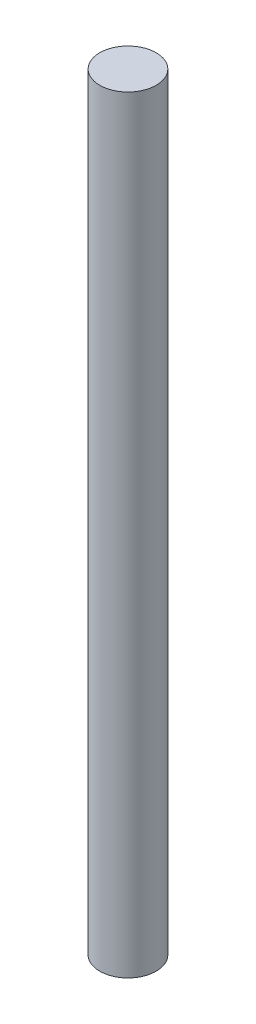
ISO-10303-21;
HEADER;
FILE_DESCRIPTION(('STEP AP214'),'2;1');
FILE_NAME('part.step','',(''),(''),'','','');
FILE_SCHEMA(('AUTOMOTIVE_DESIGN { 1 0 10303 214 1 1 1 1 }'));
ENDSEC;
DATA;
#1=APPLICATION_CONTEXT('core data for automotive mechanical design processes');
#2=APPLICATION_PROTOCOL_DEFINITION('international standard','automotive_design',2000,#1);
#3=PRODUCT_CONTEXT('',#1,'mechanical');
#4=PRODUCT('Part','Part','',(#3));
#5=PRODUCT_RELATED_PRODUCT_CATEGORY('part','',(#4));
#6=PRODUCT_DEFINITION_FORMATION('','',#4);
#7=PRODUCT_DEFINITION_CONTEXT('part definition',#1,'design');
#8=PRODUCT_DEFINITION('design','',#6,#7);
#9=PRODUCT_DEFINITION_SHAPE('','',#8);
#10=(LENGTH_UNIT() NAMED_UNIT(*) SI_UNIT(.MILLI.,.METRE.));
#11=(NAMED_UNIT(*) PLANE_ANGLE_UNIT() SI_UNIT($,.RADIAN.));
#12=(NAMED_UNIT(*) SI_UNIT($,.STERADIAN.) SOLID_ANGLE_UNIT());
#13=UNCERTAINTY_MEASURE_WITH_UNIT(LENGTH_MEASURE(1.E-05),#10,'distance_accuracy_value','');
#14=(GEOMETRIC_REPRESENTATION_CONTEXT(3) GLOBAL_UNCERTAINTY_ASSIGNED_CONTEXT((#13)) GLOBAL_UNIT_ASSIGNED_CONTEXT((#10,
#11,#12)) REPRESENTATION_CONTEXT('',''));
#15=CARTESIAN_POINT('',(0.,0.,0.));
#16=DIRECTION('',(0.,0.,1.));
#17=DIRECTION('',(1.,0.,0.));
#18=AXIS2_PLACEMENT_3D('',#15,#16,#17);
#19=CARTESIAN_POINT('',(7.49999999999998,204.,0.));
#20=DIRECTION('',(0.,-1.,0.));
#21=DIRECTION('',(1.,0.,0.));
#22=AXIS2_PLACEMENT_3D('',#19,#20,#21);
#23=PLANE('',#22);
#24=CARTESIAN_POINT('',(0.,204.,0.));
#25=DIRECTION('',(0.,1.,0.));
#26=DIRECTION('',(-1.,0.,0.));
#27=AXIS2_PLACEMENT_3D('',#24,#25,#26);
#28=CIRCLE('',#27,7.49999999999997);
#29=CARTESIAN_POINT('',(-7.49999999999997,204.,0.));
#30=VERTEX_POINT('',#29);
#31=EDGE_CURVE('E151',#30,#30,#28,.T.);
#32=ORIENTED_EDGE('',*,*,#31,.T.);
#33=EDGE_LOOP('',(#32));
#34=FACE_BOUND('',#33,.T.);
#35=ADVANCED_FACE('F33',(#34),#23,.F.);
#36=CARTESIAN_POINT('',(0.,204.,0.));
#37=DIRECTION('',(0.,1.,0.));
#38=DIRECTION('',(-1.,0.,0.));
#39=AXIS2_PLACEMENT_3D('',#36,#37,#38);
#40=CYLINDRICAL_SURFACE('',#39,7.49999999999998);
#41=DIRECTION('',(0.,1.,0.));
#42=VECTOR('',#41,1.);
#43=CARTESIAN_POINT('',(-1.49999999999999,204.,-7.34846922834952));
#44=LINE('',#43,#42);
#45=CARTESIAN_POINT('',(-1.5,89.,-7.34846922834952));
#46=VERTEX_POINT('',#45);
#47=CARTESIAN_POINT('',(-1.5,104.,-7.34846922834952));
#48=VERTEX_POINT('',#47);
#49=EDGE_CURVE('E40',#46,#48,#44,.T.);
#50=ORIENTED_EDGE('',*,*,#49,.F.);
#51=CARTESIAN_POINT('',(0.,89.,0.));
#52=DIRECTION('',(0.,-1.,0.));
#53=DIRECTION('',(0.,0.,-1.));
#54=AXIS2_PLACEMENT_3D('',#51,#52,#53);
#55=CIRCLE('',#54,7.49999999999998);
#56=CARTESIAN_POINT('',(1.5,89.,-7.34846922834952));
#57=VERTEX_POINT('',#56);
#58=EDGE_CURVE('E11',#46,#57,#55,.T.);
#59=ORIENTED_EDGE('',*,*,#58,.T.);
#60=DIRECTION('',(0.,1.,0.));
#61=VECTOR('',#60,1.);
#62=CARTESIAN_POINT('',(1.50000000000001,204.,-7.34846922834952));
#63=LINE('',#62,#61);
#64=CARTESIAN_POINT('',(1.5,104.,-7.34846922834952));
#65=VERTEX_POINT('',#64);
#66=EDGE_CURVE('E104',#65,#57,#63,.F.);
#67=ORIENTED_EDGE('',*,*,#66,.F.);
#68=CARTESIAN_POINT('',(0.,104.,0.));
#69=DIRECTION('',(0.,-1.,0.));
#70=DIRECTION('',(0.,0.,-1.));
#71=AXIS2_PLACEMENT_3D('',#68,#69,#70);
#72=CIRCLE('',#71,7.49999999999998);
#73=EDGE_CURVE('E165',#48,#65,#72,.T.);
#74=ORIENTED_EDGE('',*,*,#73,.F.);
#75=EDGE_LOOP('',(#50,#59,#67,#74));
#76=FACE_BOUND('',#75,.T.);
#77=DIRECTION('',(0.,1.,0.));
#78=VECTOR('',#77,1.);
#79=CARTESIAN_POINT('',(-1.5,204.,-7.34846922834952));
#80=LINE('',#79,#78);
#81=CARTESIAN_POINT('',(-1.5,187.,-7.34846922834952));
#82=VERTEX_POINT('',#81);
#83=CARTESIAN_POINT('',(-1.49999999999999,169.,-7.34846922834952));
#84=VERTEX_POINT('',#83);
#85=EDGE_CURVE('E159',#82,#84,#80,.F.);
#86=ORIENTED_EDGE('',*,*,#85,.T.);
#87=CARTESIAN_POINT('',(0.,169.,0.));
#88=DIRECTION('',(0.,-1.,0.));
#89=DIRECTION('',(0.,0.,-1.));
#90=AXIS2_PLACEMENT_3D('',#87,#88,#89);
#91=CIRCLE('',#90,7.49999999999998);
#92=CARTESIAN_POINT('',(1.50000000000001,169.,-7.34846922834952));
#93=VERTEX_POINT('',#92);
#94=EDGE_CURVE('E162',#84,#93,#91,.T.);
#95=ORIENTED_EDGE('',*,*,#94,.T.);
#96=DIRECTION('',(0.,1.,0.));
#97=VECTOR('',#96,1.);
#98=CARTESIAN_POINT('',(1.5,204.,-7.34846922834952));
#99=LINE('',#98,#97);
#100=CARTESIAN_POINT('',(1.50000000000001,187.,-7.34846922834952));
#101=VERTEX_POINT('',#100);
#102=EDGE_CURVE('E156',#93,#101,#99,.T.);
#103=ORIENTED_EDGE('',*,*,#102,.T.);
#104=CARTESIAN_POINT('',(0.,187.,0.));
#105=DIRECTION('',(0.,-1.,0.));
#106=DIRECTION('',(0.,0.,-1.));
#107=AXIS2_PLACEMENT_3D('',#104,#105,#106);
#108=CIRCLE('',#107,7.49999999999998);
#109=EDGE_CURVE('E154',#82,#101,#108,.T.);
#110=ORIENTED_EDGE('',*,*,#109,.F.);
#111=EDGE_LOOP('',(#86,#95,#103,#110));
#112=FACE_BOUND('',#111,.T.);
#113=ORIENTED_EDGE('',*,*,#31,.F.);
#114=EDGE_LOOP('',(#113));
#115=FACE_BOUND('',#114,.T.);
#116=CARTESIAN_POINT('',(0.,0.,0.));
#117=DIRECTION('',(0.,1.,0.));
#118=DIRECTION('',(-1.,0.,0.));
#119=AXIS2_PLACEMENT_3D('',#116,#117,#118);
#120=CIRCLE('',#119,7.5);
#121=CARTESIAN_POINT('',(-7.5,0.,0.));
#122=VERTEX_POINT('',#121);
#123=EDGE_CURVE('E146',#122,#122,#120,.T.);
#124=ORIENTED_EDGE('',*,*,#123,.T.);
#125=EDGE_LOOP('',(#124));
#126=FACE_BOUND('',#125,.T.);
#127=ADVANCED_FACE('F172',(#76,#112,#115,#126),#40,.T.);
#128=CARTESIAN_POINT('',(7.5,0.,0.));
#129=DIRECTION('',(0.,1.,0.));
#130=DIRECTION('',(-1.,0.,0.));
#131=AXIS2_PLACEMENT_3D('',#128,#129,#130);
#132=PLANE('',#131);
#133=ORIENTED_EDGE('',*,*,#123,.F.);
#134=EDGE_LOOP('',(#133));
#135=FACE_BOUND('',#134,.T.);
#136=ADVANCED_FACE('F189',(#135),#132,.F.);
#137=CARTESIAN_POINT('',(-1.49999999999999,169.,-8.99999999999997));
#138=DIRECTION('',(-1.,0.,0.));
#139=DIRECTION('',(0.,0.,1.));
#140=AXIS2_PLACEMENT_3D('',#137,#138,#139);
#141=PLANE('',#140);
#142=DIRECTION('',(0.,0.,1.));
#143=VECTOR('',#142,1.);
#144=CARTESIAN_POINT('',(-1.5,187.,-8.99999999999997));
#145=LINE('',#144,#143);
#146=CARTESIAN_POINT('',(-1.5,187.,-5.99999999999997));
#147=VERTEX_POINT('',#146);
#148=EDGE_CURVE('E55',#82,#147,#145,.T.);
#149=ORIENTED_EDGE('',*,*,#148,.T.);
#150=DIRECTION('',(0.,1.,0.));
#151=VECTOR('',#150,1.);
#152=CARTESIAN_POINT('',(-1.49999999999999,169.,-5.99999999999997));
#153=LINE('',#152,#151);
#154=CARTESIAN_POINT('',(-1.49999999999999,169.,-5.99999999999997));
#155=VERTEX_POINT('',#154);
#156=EDGE_CURVE('E137',#155,#147,#153,.T.);
#157=ORIENTED_EDGE('',*,*,#156,.F.);
#158=DIRECTION('',(0.,0.,1.));
#159=VECTOR('',#158,1.);
#160=CARTESIAN_POINT('',(-1.49999999999999,169.,-8.99999999999997));
#161=LINE('',#160,#159);
#162=EDGE_CURVE('E128',#84,#155,#161,.T.);
#163=ORIENTED_EDGE('',*,*,#162,.F.);
#164=ORIENTED_EDGE('',*,*,#85,.F.);
#165=EDGE_LOOP('',(#149,#157,#163,#164));
#166=FACE_BOUND('',#165,.T.);
#167=ADVANCED_FACE('F196',(#166),#141,.F.);
#168=CARTESIAN_POINT('',(1.50000000000001,169.,-8.99999999999997));
#169=DIRECTION('',(1.,0.,0.));
#170=DIRECTION('',(0.,1.,0.));
#171=AXIS2_PLACEMENT_3D('',#168,#169,#170);
#172=PLANE('',#171);
#173=DIRECTION('',(0.,0.,-1.));
#174=VECTOR('',#173,1.);
#175=CARTESIAN_POINT('',(1.50000000000001,169.,-8.99999999999997));
#176=LINE('',#175,#174);
#177=CARTESIAN_POINT('',(1.50000000000001,169.,-5.99999999999997));
#178=VERTEX_POINT('',#177);
#179=EDGE_CURVE('E134',#178,#93,#176,.T.);
#180=ORIENTED_EDGE('',*,*,#179,.F.);
#181=DIRECTION('',(0.,1.,0.));
#182=VECTOR('',#181,1.);
#183=CARTESIAN_POINT('',(1.50000000000001,169.,-5.99999999999997));
#184=LINE('',#183,#182);
#185=CARTESIAN_POINT('',(1.50000000000001,187.,-5.99999999999997));
#186=VERTEX_POINT('',#185);
#187=EDGE_CURVE('E144',#178,#186,#184,.T.);
#188=ORIENTED_EDGE('',*,*,#187,.T.);
#189=DIRECTION('',(0.,0.,-1.));
#190=VECTOR('',#189,1.);
#191=CARTESIAN_POINT('',(1.50000000000001,187.,-8.99999999999997));
#192=LINE('',#191,#190);
#193=EDGE_CURVE('E131',#186,#101,#192,.T.);
#194=ORIENTED_EDGE('',*,*,#193,.T.);
#195=ORIENTED_EDGE('',*,*,#102,.F.);
#196=EDGE_LOOP('',(#180,#188,#194,#195));
#197=FACE_BOUND('',#196,.T.);
#198=ADVANCED_FACE('F201',(#197),#172,.F.);
#199=CARTESIAN_POINT('',(0.,169.,0.));
#200=DIRECTION('',(0.,-1.,0.));
#201=DIRECTION('',(0.,0.,-1.));
#202=AXIS2_PLACEMENT_3D('',#199,#200,#201);
#203=PLANE('',#202);
#204=ORIENTED_EDGE('',*,*,#162,.T.);
#205=DIRECTION('',(1.,0.,0.));
#206=VECTOR('',#205,1.);
#207=CARTESIAN_POINT('',(1.50000000000001,169.,-5.99999999999997));
#208=LINE('',#207,#206);
#209=EDGE_CURVE('E130',#155,#178,#208,.T.);
#210=ORIENTED_EDGE('',*,*,#209,.T.);
#211=ORIENTED_EDGE('',*,*,#179,.T.);
#212=ORIENTED_EDGE('',*,*,#94,.F.);
#213=EDGE_LOOP('',(#204,#210,#211,#212));
#214=FACE_BOUND('',#213,.T.);
#215=ADVANCED_FACE('F212',(#214),#203,.F.);
#216=CARTESIAN_POINT('',(0.,187.,0.));
#217=DIRECTION('',(0.,-1.,0.));
#218=DIRECTION('',(0.,0.,-1.));
#219=AXIS2_PLACEMENT_3D('',#216,#217,#218);
#220=PLANE('',#219);
#221=ORIENTED_EDGE('',*,*,#109,.T.);
#222=ORIENTED_EDGE('',*,*,#193,.F.);
#223=DIRECTION('',(1.,0.,0.));
#224=VECTOR('',#223,1.);
#225=CARTESIAN_POINT('',(1.50000000000001,187.,-5.99999999999997));
#226=LINE('',#225,#224);
#227=EDGE_CURVE('E139',#147,#186,#226,.T.);
#228=ORIENTED_EDGE('',*,*,#227,.F.);
#229=ORIENTED_EDGE('',*,*,#148,.F.);
#230=EDGE_LOOP('',(#221,#222,#228,#229));
#231=FACE_BOUND('',#230,.T.);
#232=ADVANCED_FACE('F208',(#231),#220,.T.);
#233=CARTESIAN_POINT('',(1.50000000000001,169.,-5.99999999999997));
#234=DIRECTION('',(0.,0.,1.));
#235=DIRECTION('',(1.,0.,0.));
#236=AXIS2_PLACEMENT_3D('',#233,#234,#235);
#237=PLANE('',#236);
#238=ORIENTED_EDGE('',*,*,#227,.T.);
#239=ORIENTED_EDGE('',*,*,#187,.F.);
#240=ORIENTED_EDGE('',*,*,#209,.F.);
#241=ORIENTED_EDGE('',*,*,#156,.T.);
#242=EDGE_LOOP('',(#238,#239,#240,#241));
#243=FACE_BOUND('',#242,.T.);
#244=ADVANCED_FACE('F205',(#243),#237,.F.);
#245=CARTESIAN_POINT('',(-1.5,89.,-9.));
#246=DIRECTION('',(1.,0.,0.));
#247=DIRECTION('',(0.,0.,-1.));
#248=AXIS2_PLACEMENT_3D('',#245,#246,#247);
#249=PLANE('',#248);
#250=ORIENTED_EDGE('',*,*,#49,.T.);
#251=DIRECTION('',(0.,0.,-1.));
#252=VECTOR('',#251,1.);
#253=CARTESIAN_POINT('',(-1.5,104.,-9.));
#254=LINE('',#253,#252);
#255=CARTESIAN_POINT('',(-1.5,104.,-6.));
#256=VERTEX_POINT('',#255);
#257=EDGE_CURVE('E47',#256,#48,#254,.T.);
#258=ORIENTED_EDGE('',*,*,#257,.F.);
#259=DIRECTION('',(0.,1.,0.));
#260=VECTOR('',#259,1.);
#261=CARTESIAN_POINT('',(-1.5,89.,-6.));
#262=LINE('',#261,#260);
#263=CARTESIAN_POINT('',(-1.5,89.,-6.));
#264=VERTEX_POINT('',#263);
#265=EDGE_CURVE('E115',#264,#256,#262,.T.);
#266=ORIENTED_EDGE('',*,*,#265,.F.);
#267=DIRECTION('',(0.,0.,-1.));
#268=VECTOR('',#267,1.);
#269=CARTESIAN_POINT('',(-1.5,89.,-9.));
#270=LINE('',#269,#268);
#271=EDGE_CURVE('E108',#264,#46,#270,.T.);
#272=ORIENTED_EDGE('',*,*,#271,.T.);
#273=EDGE_LOOP('',(#250,#258,#266,#272));
#274=FACE_BOUND('',#273,.T.);
#275=ADVANCED_FACE('F170',(#274),#249,.T.);
#276=CARTESIAN_POINT('',(1.5,89.,-9.));
#277=DIRECTION('',(-1.,0.,0.));
#278=DIRECTION('',(0.,0.,1.));
#279=AXIS2_PLACEMENT_3D('',#276,#277,#278);
#280=PLANE('',#279);
#281=ORIENTED_EDGE('',*,*,#66,.T.);
#282=DIRECTION('',(0.,0.,1.));
#283=VECTOR('',#282,1.);
#284=CARTESIAN_POINT('',(1.5,89.,-9.));
#285=LINE('',#284,#283);
#286=CARTESIAN_POINT('',(1.5,89.,-6.));
#287=VERTEX_POINT('',#286);
#288=EDGE_CURVE('E97',#57,#287,#285,.T.);
#289=ORIENTED_EDGE('',*,*,#288,.T.);
#290=DIRECTION('',(0.,1.,0.));
#291=VECTOR('',#290,1.);
#292=CARTESIAN_POINT('',(1.5,89.,-6.));
#293=LINE('',#292,#291);
#294=CARTESIAN_POINT('',(1.5,104.,-6.));
#295=VERTEX_POINT('',#294);
#296=EDGE_CURVE('E101',#287,#295,#293,.T.);
#297=ORIENTED_EDGE('',*,*,#296,.T.);
#298=DIRECTION('',(0.,0.,1.));
#299=VECTOR('',#298,1.);
#300=CARTESIAN_POINT('',(1.5,104.,-9.));
#301=LINE('',#300,#299);
#302=EDGE_CURVE('E125',#65,#295,#301,.T.);
#303=ORIENTED_EDGE('',*,*,#302,.F.);
#304=EDGE_LOOP('',(#281,#289,#297,#303));
#305=FACE_BOUND('',#304,.T.);
#306=ADVANCED_FACE('F99',(#305),#280,.T.);
#307=CARTESIAN_POINT('',(0.,89.,0.));
#308=DIRECTION('',(0.,-1.,0.));
#309=DIRECTION('',(0.,0.,-1.));
#310=AXIS2_PLACEMENT_3D('',#307,#308,#309);
#311=PLANE('',#310);
#312=ORIENTED_EDGE('',*,*,#271,.F.);
#313=DIRECTION('',(-1.,0.,0.));
#314=VECTOR('',#313,1.);
#315=CARTESIAN_POINT('',(1.5,89.,-6.));
#316=LINE('',#315,#314);
#317=EDGE_CURVE('E107',#287,#264,#316,.T.);
#318=ORIENTED_EDGE('',*,*,#317,.F.);
#319=ORIENTED_EDGE('',*,*,#288,.F.);
#320=ORIENTED_EDGE('',*,*,#58,.F.);
#321=EDGE_LOOP('',(#312,#318,#319,#320));
#322=FACE_BOUND('',#321,.T.);
#323=ADVANCED_FACE('F118',(#322),#311,.F.);
#324=CARTESIAN_POINT('',(0.,104.,0.));
#325=DIRECTION('',(0.,-1.,0.));
#326=DIRECTION('',(0.,0.,-1.));
#327=AXIS2_PLACEMENT_3D('',#324,#325,#326);
#328=PLANE('',#327);
#329=ORIENTED_EDGE('',*,*,#73,.T.);
#330=ORIENTED_EDGE('',*,*,#302,.T.);
#331=DIRECTION('',(-1.,0.,0.));
#332=VECTOR('',#331,1.);
#333=CARTESIAN_POINT('',(1.5,104.,-6.));
#334=LINE('',#333,#332);
#335=EDGE_CURVE('E114',#295,#256,#334,.T.);
#336=ORIENTED_EDGE('',*,*,#335,.T.);
#337=ORIENTED_EDGE('',*,*,#257,.T.);
#338=EDGE_LOOP('',(#329,#330,#336,#337));
#339=FACE_BOUND('',#338,.T.);
#340=ADVANCED_FACE('F174',(#339),#328,.T.);
#341=CARTESIAN_POINT('',(1.5,89.,-6.));
#342=DIRECTION('',(0.,0.,-1.));
#343=DIRECTION('',(-1.,0.,0.));
#344=AXIS2_PLACEMENT_3D('',#341,#342,#343);
#345=PLANE('',#344);
#346=ORIENTED_EDGE('',*,*,#335,.F.);
#347=ORIENTED_EDGE('',*,*,#296,.F.);
#348=ORIENTED_EDGE('',*,*,#317,.T.);
#349=ORIENTED_EDGE('',*,*,#265,.T.);
#350=EDGE_LOOP('',(#346,#347,#348,#349));
#351=FACE_BOUND('',#350,.T.);
#352=ADVANCED_FACE('F111',(#351),#345,.T.);
#353=CLOSED_SHELL('',(#35,#127,#136,#167,#198,#215,#232,#244,#275,#306,#323,#340,#352));
#354=MANIFOLD_SOLID_BREP('B2',#353);
#355=ADVANCED_BREP_SHAPE_REPRESENTATION('',(#18,#354),#14);
#356=SHAPE_DEFINITION_REPRESENTATION(#9,#355);
ENDSEC;
END-ISO-10303-21;
